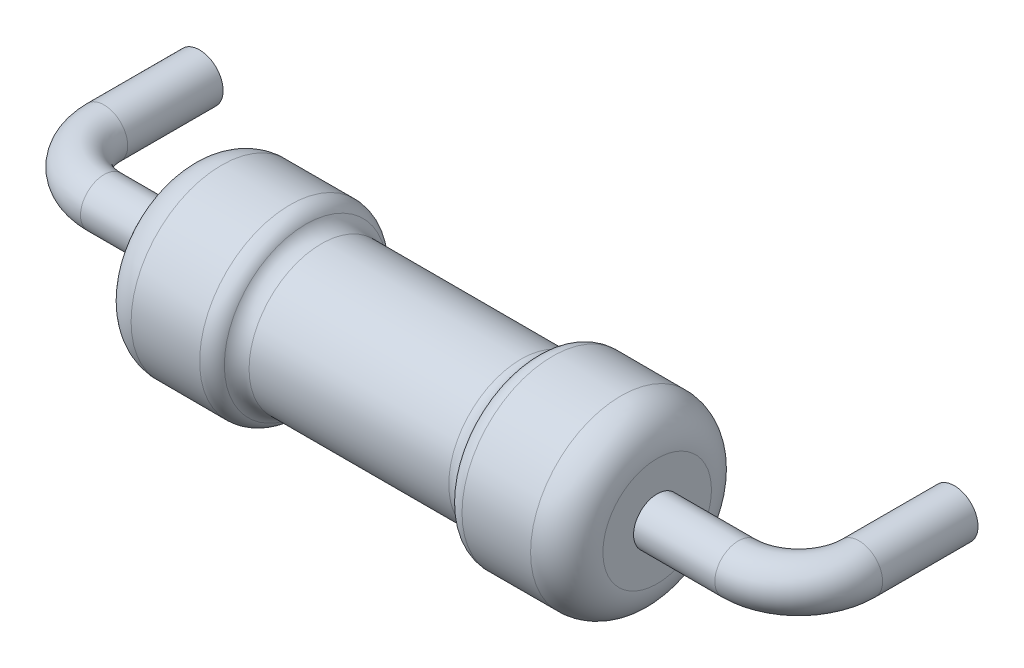
ISO-10303-21;
HEADER;
FILE_DESCRIPTION(('STEP AP214'),'2;1');
FILE_NAME('part.step','',(''),(''),'','','');
FILE_SCHEMA(('AUTOMOTIVE_DESIGN { 1 0 10303 214 1 1 1 1 }'));
ENDSEC;
DATA;
#1=APPLICATION_CONTEXT('core data for automotive mechanical design processes');
#2=APPLICATION_PROTOCOL_DEFINITION('international standard','automotive_design',2000,#1);
#3=PRODUCT_CONTEXT('',#1,'mechanical');
#4=PRODUCT('Part','Part','',(#3));
#5=PRODUCT_RELATED_PRODUCT_CATEGORY('part','',(#4));
#6=PRODUCT_DEFINITION_FORMATION('','',#4);
#7=PRODUCT_DEFINITION_CONTEXT('part definition',#1,'design');
#8=PRODUCT_DEFINITION('design','',#6,#7);
#9=PRODUCT_DEFINITION_SHAPE('','',#8);
#10=(LENGTH_UNIT() NAMED_UNIT(*) SI_UNIT(.MILLI.,.METRE.));
#11=(NAMED_UNIT(*) PLANE_ANGLE_UNIT() SI_UNIT($,.RADIAN.));
#12=(NAMED_UNIT(*) SI_UNIT($,.STERADIAN.) SOLID_ANGLE_UNIT());
#13=UNCERTAINTY_MEASURE_WITH_UNIT(LENGTH_MEASURE(1.E-05),#10,'distance_accuracy_value','');
#14=(GEOMETRIC_REPRESENTATION_CONTEXT(3) GLOBAL_UNCERTAINTY_ASSIGNED_CONTEXT((#13)) GLOBAL_UNIT_ASSIGNED_CONTEXT((#10,
#11,#12)) REPRESENTATION_CONTEXT('',''));
#15=CARTESIAN_POINT('',(0.,0.,0.));
#16=DIRECTION('',(0.,0.,1.));
#17=DIRECTION('',(1.,0.,0.));
#18=AXIS2_PLACEMENT_3D('',#15,#16,#17);
#19=CARTESIAN_POINT('',(3.,0.,1.38));
#20=DIRECTION('',(-1.,0.,0.));
#21=DIRECTION('',(0.,0.,-1.));
#22=AXIS2_PLACEMENT_3D('',#19,#20,#21);
#23=PLANE('',#22);
#24=CARTESIAN_POINT('',(3.,0.,1.38));
#25=DIRECTION('',(1.,0.,0.));
#26=DIRECTION('',(0.,0.,-1.));
#27=AXIS2_PLACEMENT_3D('',#24,#25,#26);
#28=CIRCLE('',#27,0.3);
#29=CARTESIAN_POINT('',(3.,0.,1.08));
#30=VERTEX_POINT('',#29);
#31=EDGE_CURVE('E58',#30,#30,#28,.T.);
#32=ORIENTED_EDGE('',*,*,#31,.F.);
#33=EDGE_LOOP('',(#32));
#34=FACE_BOUND('',#33,.T.);
#35=ADVANCED_FACE('F48',(#34),#23,.T.);
#36=CARTESIAN_POINT('',(3.,0.,1.38));
#37=DIRECTION('',(1.,0.,0.));
#38=DIRECTION('',(0.,0.,1.));
#39=AXIS2_PLACEMENT_3D('',#36,#37,#38);
#40=CYLINDRICAL_SURFACE('',#39,0.3);
#41=CARTESIAN_POINT('',(4.03333333333333,0.,1.38));
#42=DIRECTION('',(1.,0.,0.));
#43=DIRECTION('',(0.,0.,-1.));
#44=AXIS2_PLACEMENT_3D('',#41,#42,#43);
#45=CIRCLE('',#44,0.3);
#46=CARTESIAN_POINT('',(4.03333333333333,0.,1.68));
#47=VERTEX_POINT('',#46);
#48=EDGE_CURVE('E54',#47,#47,#45,.T.);
#49=ORIENTED_EDGE('',*,*,#48,.F.);
#50=EDGE_LOOP('',(#49));
#51=FACE_BOUND('',#50,.T.);
#52=ORIENTED_EDGE('',*,*,#31,.T.);
#53=EDGE_LOOP('',(#52));
#54=FACE_BOUND('',#53,.T.);
#55=ADVANCED_FACE('F59',(#51,#54),#40,.T.);
#56=CARTESIAN_POINT('',(4.03333333333333,0.,0.613333333333334));
#57=DIRECTION('',(0.,-1.,0.));
#58=DIRECTION('',(0.,0.,-1.));
#59=AXIS2_PLACEMENT_3D('',#56,#57,#58);
#60=TOROIDAL_SURFACE('',#59,0.766666666666666,0.3);
#61=CARTESIAN_POINT('',(4.8,0.,0.61333333333334));
#62=DIRECTION('',(0.,0.,-1.));
#63=DIRECTION('',(-1.,0.,0.));
#64=AXIS2_PLACEMENT_3D('',#61,#62,#63);
#65=CIRCLE('',#64,0.3);
#66=CARTESIAN_POINT('',(5.1,0.,0.613333333333343));
#67=VERTEX_POINT('',#66);
#68=EDGE_CURVE('E12',#67,#67,#65,.T.);
#69=CARTESIAN_POINT('',(4.03333333333333,0.,0.613333333333334));
#70=DIRECTION('',(0.,-1.,0.));
#71=DIRECTION('',(0.,0.,-1.));
#72=AXIS2_PLACEMENT_3D('',#69,#70,#71);
#73=CIRCLE('',#72,1.06666666666667);
#74=EDGE_CURVE('',#67,#47,#73,.T.);
#75=ORIENTED_EDGE('',*,*,#68,.F.);
#76=ORIENTED_EDGE('',*,*,#48,.T.);
#77=ORIENTED_EDGE('',*,*,#74,.T.);
#78=ORIENTED_EDGE('',*,*,#74,.F.);
#79=EDGE_LOOP('',(#75,#77,#76,#78));
#80=FACE_BOUND('',#79,.T.);
#81=ADVANCED_FACE('F72',(#80),#60,.T.);
#82=CARTESIAN_POINT('',(4.8,0.,0.613333333333334));
#83=DIRECTION('',(0.,0.,-1.));
#84=DIRECTION('',(1.,0.,0.));
#85=AXIS2_PLACEMENT_3D('',#82,#83,#84);
#86=CYLINDRICAL_SURFACE('',#85,0.3);
#87=ORIENTED_EDGE('',*,*,#68,.T.);
#88=EDGE_LOOP('',(#87));
#89=FACE_BOUND('',#88,.T.);
#90=CARTESIAN_POINT('',(4.8,0.,-0.6));
#91=DIRECTION('',(0.,0.,-1.));
#92=DIRECTION('',(-1.,0.,0.));
#93=AXIS2_PLACEMENT_3D('',#90,#91,#92);
#94=CIRCLE('',#93,0.3);
#95=CARTESIAN_POINT('',(4.5,0.,-0.6));
#96=VERTEX_POINT('',#95);
#97=EDGE_CURVE('E61',#96,#96,#94,.T.);
#98=ORIENTED_EDGE('',*,*,#97,.F.);
#99=EDGE_LOOP('',(#98));
#100=FACE_BOUND('',#99,.T.);
#101=ADVANCED_FACE('F70',(#89,#100),#86,.T.);
#102=CARTESIAN_POINT('',(4.8,0.,-0.6));
#103=DIRECTION('',(0.,0.,-1.));
#104=DIRECTION('',(-1.,0.,0.));
#105=AXIS2_PLACEMENT_3D('',#102,#103,#104);
#106=PLANE('',#105);
#107=ORIENTED_EDGE('',*,*,#97,.T.);
#108=EDGE_LOOP('',(#107));
#109=FACE_BOUND('',#108,.T.);
#110=ADVANCED_FACE('F68',(#109),#106,.T.);
#111=CLOSED_SHELL('',(#35,#55,#81,#101,#110));
#112=MANIFOLD_SOLID_BREP('B2',#111);
#113=CARTESIAN_POINT('',(-3.,0.,1.38));
#114=DIRECTION('',(1.,0.,0.));
#115=DIRECTION('',(0.,0.,-1.));
#116=AXIS2_PLACEMENT_3D('',#113,#114,#115);
#117=PLANE('',#116);
#118=CARTESIAN_POINT('',(-3.,0.,1.38));
#119=DIRECTION('',(1.,0.,0.));
#120=DIRECTION('',(0.,0.,-1.));
#121=AXIS2_PLACEMENT_3D('',#118,#119,#120);
#122=CIRCLE('',#121,0.3);
#123=CARTESIAN_POINT('',(-3.,0.,1.08));
#124=VERTEX_POINT('',#123);
#125=EDGE_CURVE('E159',#124,#124,#122,.T.);
#126=ORIENTED_EDGE('',*,*,#125,.T.);
#127=EDGE_LOOP('',(#126));
#128=FACE_BOUND('',#127,.T.);
#129=ADVANCED_FACE('F149',(#128),#117,.T.);
#130=CARTESIAN_POINT('',(-3.,0.,1.38));
#131=DIRECTION('',(-1.,0.,0.));
#132=DIRECTION('',(0.,0.,1.));
#133=AXIS2_PLACEMENT_3D('',#130,#131,#132);
#134=CYLINDRICAL_SURFACE('',#133,0.3);
#135=CARTESIAN_POINT('',(-4.03333333333333,0.,1.38));
#136=DIRECTION('',(1.,0.,0.));
#137=DIRECTION('',(0.,0.,-1.));
#138=AXIS2_PLACEMENT_3D('',#135,#136,#137);
#139=CIRCLE('',#138,0.3);
#140=CARTESIAN_POINT('',(-4.03333333333333,0.,1.68));
#141=VERTEX_POINT('',#140);
#142=EDGE_CURVE('E155',#141,#141,#139,.T.);
#143=ORIENTED_EDGE('',*,*,#142,.T.);
#144=EDGE_LOOP('',(#143));
#145=FACE_BOUND('',#144,.T.);
#146=ORIENTED_EDGE('',*,*,#125,.F.);
#147=EDGE_LOOP('',(#146));
#148=FACE_BOUND('',#147,.T.);
#149=ADVANCED_FACE('F160',(#145,#148),#134,.T.);
#150=CARTESIAN_POINT('',(-4.03333333333333,0.,0.613333333333334));
#151=DIRECTION('',(0.,-1.,0.));
#152=DIRECTION('',(0.,0.,-1.));
#153=AXIS2_PLACEMENT_3D('',#150,#151,#152);
#154=TOROIDAL_SURFACE('',#153,0.766666666666666,0.3);
#155=CARTESIAN_POINT('',(-4.8,0.,0.61333333333334));
#156=DIRECTION('',(0.,0.,1.));
#157=DIRECTION('',(1.,0.,0.));
#158=AXIS2_PLACEMENT_3D('',#155,#156,#157);
#159=CIRCLE('',#158,0.3);
#160=CARTESIAN_POINT('',(-5.1,0.,0.613333333333343));
#161=VERTEX_POINT('',#160);
#162=EDGE_CURVE('E46',#161,#161,#159,.T.);
#163=CARTESIAN_POINT('',(-4.03333333333333,0.,0.613333333333334));
#164=DIRECTION('',(0.,-1.,0.));
#165=DIRECTION('',(0.,0.,-1.));
#166=AXIS2_PLACEMENT_3D('',#163,#164,#165);
#167=CIRCLE('',#166,1.06666666666667);
#168=EDGE_CURVE('',#141,#161,#167,.T.);
#169=ORIENTED_EDGE('',*,*,#142,.F.);
#170=ORIENTED_EDGE('',*,*,#162,.T.);
#171=ORIENTED_EDGE('',*,*,#168,.T.);
#172=ORIENTED_EDGE('',*,*,#168,.F.);
#173=EDGE_LOOP('',(#169,#171,#170,#172));
#174=FACE_BOUND('',#173,.T.);
#175=ADVANCED_FACE('F173',(#174),#154,.T.);
#176=CARTESIAN_POINT('',(-4.8,0.,0.613333333333334));
#177=DIRECTION('',(0.,0.,-1.));
#178=DIRECTION('',(-1.,0.,0.));
#179=AXIS2_PLACEMENT_3D('',#176,#177,#178);
#180=CYLINDRICAL_SURFACE('',#179,0.3);
#181=ORIENTED_EDGE('',*,*,#162,.F.);
#182=EDGE_LOOP('',(#181));
#183=FACE_BOUND('',#182,.T.);
#184=CARTESIAN_POINT('',(-4.8,0.,-0.6));
#185=DIRECTION('',(0.,0.,-1.));
#186=DIRECTION('',(-1.,0.,0.));
#187=AXIS2_PLACEMENT_3D('',#184,#185,#186);
#188=CIRCLE('',#187,0.3);
#189=CARTESIAN_POINT('',(-5.1,0.,-0.6));
#190=VERTEX_POINT('',#189);
#191=EDGE_CURVE('E162',#190,#190,#188,.T.);
#192=ORIENTED_EDGE('',*,*,#191,.F.);
#193=EDGE_LOOP('',(#192));
#194=FACE_BOUND('',#193,.T.);
#195=ADVANCED_FACE('F171',(#183,#194),#180,.T.);
#196=CARTESIAN_POINT('',(-4.8,0.,-0.6));
#197=DIRECTION('',(0.,0.,-1.));
#198=DIRECTION('',(-1.,0.,0.));
#199=AXIS2_PLACEMENT_3D('',#196,#197,#198);
#200=PLANE('',#199);
#201=ORIENTED_EDGE('',*,*,#191,.T.);
#202=EDGE_LOOP('',(#201));
#203=FACE_BOUND('',#202,.T.);
#204=ADVANCED_FACE('F169',(#203),#200,.T.);
#205=CLOSED_SHELL('',(#129,#149,#175,#195,#204));
#206=MANIFOLD_SOLID_BREP('B6',#205);
#207=CARTESIAN_POINT('',(1.5,0.,1.38));
#208=DIRECTION('',(-1.,0.,0.));
#209=DIRECTION('',(0.,0.,1.));
#210=AXIS2_PLACEMENT_3D('',#207,#208,#209);
#211=CYLINDRICAL_SURFACE('',#210,0.92);
#212=CARTESIAN_POINT('',(-1.27,0.,1.38));
#213=DIRECTION('',(-1.,0.,0.));
#214=DIRECTION('',(0.,0.,1.));
#215=AXIS2_PLACEMENT_3D('',#212,#213,#214);
#216=CIRCLE('',#215,0.92);
#217=CARTESIAN_POINT('',(-1.27,0.,2.3));
#218=VERTEX_POINT('',#217);
#219=EDGE_CURVE('E243',#218,#218,#216,.F.);
#220=ORIENTED_EDGE('',*,*,#219,.T.);
#221=EDGE_LOOP('',(#220));
#222=FACE_BOUND('',#221,.T.);
#223=CARTESIAN_POINT('',(1.27,0.,1.38));
#224=DIRECTION('',(1.,0.,0.));
#225=DIRECTION('',(0.,0.,-1.));
#226=AXIS2_PLACEMENT_3D('',#223,#224,#225);
#227=CIRCLE('',#226,0.92);
#228=CARTESIAN_POINT('',(1.27,0.,0.46));
#229=VERTEX_POINT('',#228);
#230=EDGE_CURVE('E246',#229,#229,#227,.F.);
#231=ORIENTED_EDGE('',*,*,#230,.T.);
#232=EDGE_LOOP('',(#231));
#233=FACE_BOUND('',#232,.T.);
#234=ADVANCED_FACE('F223',(#222,#233),#211,.T.);
#235=CARTESIAN_POINT('',(-3.,0.,1.38));
#236=DIRECTION('',(1.,0.,0.));
#237=DIRECTION('',(0.,0.,-1.));
#238=AXIS2_PLACEMENT_3D('',#235,#236,#237);
#239=CYLINDRICAL_SURFACE('',#238,1.15);
#240=CARTESIAN_POINT('',(-1.66837168574094,0.,1.38));
#241=DIRECTION('',(1.,0.,0.));
#242=DIRECTION('',(0.,0.,-1.));
#243=AXIS2_PLACEMENT_3D('',#240,#241,#242);
#244=CIRCLE('',#243,1.15);
#245=CARTESIAN_POINT('',(-1.66837168574094,0.,0.23));
#246=VERTEX_POINT('',#245);
#247=EDGE_CURVE('E230',#246,#246,#244,.F.);
#248=ORIENTED_EDGE('',*,*,#247,.T.);
#249=EDGE_LOOP('',(#248));
#250=FACE_BOUND('',#249,.T.);
#251=CARTESIAN_POINT('',(-2.54,0.,1.38));
#252=DIRECTION('',(-1.,0.,0.));
#253=DIRECTION('',(0.,0.,1.));
#254=AXIS2_PLACEMENT_3D('',#251,#252,#253);
#255=CIRCLE('',#254,1.15);
#256=CARTESIAN_POINT('',(-2.54,0.,2.53));
#257=VERTEX_POINT('',#256);
#258=EDGE_CURVE('E249',#257,#257,#255,.F.);
#259=ORIENTED_EDGE('',*,*,#258,.T.);
#260=EDGE_LOOP('',(#259));
#261=FACE_BOUND('',#260,.T.);
#262=ADVANCED_FACE('F281',(#250,#261),#239,.T.);
#263=CARTESIAN_POINT('',(-3.,0.,1.38));
#264=DIRECTION('',(-1.,0.,0.));
#265=DIRECTION('',(0.,0.,1.));
#266=AXIS2_PLACEMENT_3D('',#263,#264,#265);
#267=PLANE('',#266);
#268=CARTESIAN_POINT('',(-3.,0.,1.38));
#269=DIRECTION('',(-1.,0.,0.));
#270=DIRECTION('',(0.,0.,1.));
#271=AXIS2_PLACEMENT_3D('',#268,#269,#270);
#272=CIRCLE('',#271,0.69);
#273=CARTESIAN_POINT('',(-3.,0.,2.07));
#274=VERTEX_POINT('',#273);
#275=EDGE_CURVE('E252',#274,#274,#272,.T.);
#276=ORIENTED_EDGE('',*,*,#275,.T.);
#277=EDGE_LOOP('',(#276));
#278=FACE_BOUND('',#277,.T.);
#279=ADVANCED_FACE('F286',(#278),#267,.T.);
#280=CARTESIAN_POINT('',(3.,0.,1.38));
#281=DIRECTION('',(-1.,0.,0.));
#282=DIRECTION('',(0.,0.,1.));
#283=AXIS2_PLACEMENT_3D('',#280,#281,#282);
#284=CYLINDRICAL_SURFACE('',#283,1.15);
#285=CARTESIAN_POINT('',(1.66837168574094,0.,1.38));
#286=DIRECTION('',(-1.,0.,0.));
#287=DIRECTION('',(0.,0.,1.));
#288=AXIS2_PLACEMENT_3D('',#285,#286,#287);
#289=CIRCLE('',#288,1.15);
#290=CARTESIAN_POINT('',(1.66837168574094,0.,2.53));
#291=VERTEX_POINT('',#290);
#292=EDGE_CURVE('E238',#291,#291,#289,.F.);
#293=ORIENTED_EDGE('',*,*,#292,.T.);
#294=EDGE_LOOP('',(#293));
#295=FACE_BOUND('',#294,.T.);
#296=CARTESIAN_POINT('',(2.54,0.,1.38));
#297=DIRECTION('',(1.,0.,0.));
#298=DIRECTION('',(0.,0.,-1.));
#299=AXIS2_PLACEMENT_3D('',#296,#297,#298);
#300=CIRCLE('',#299,1.15);
#301=CARTESIAN_POINT('',(2.54,0.,0.23));
#302=VERTEX_POINT('',#301);
#303=EDGE_CURVE('E255',#302,#302,#300,.F.);
#304=ORIENTED_EDGE('',*,*,#303,.T.);
#305=EDGE_LOOP('',(#304));
#306=FACE_BOUND('',#305,.T.);
#307=ADVANCED_FACE('F276',(#295,#306),#284,.T.);
#308=CARTESIAN_POINT('',(3.,0.,1.38));
#309=DIRECTION('',(1.,0.,0.));
#310=DIRECTION('',(0.,0.,-1.));
#311=AXIS2_PLACEMENT_3D('',#308,#309,#310);
#312=PLANE('',#311);
#313=CARTESIAN_POINT('',(3.,0.,1.38));
#314=DIRECTION('',(1.,0.,0.));
#315=DIRECTION('',(0.,0.,-1.));
#316=AXIS2_PLACEMENT_3D('',#313,#314,#315);
#317=CIRCLE('',#316,0.69);
#318=CARTESIAN_POINT('',(3.,0.,0.69));
#319=VERTEX_POINT('',#318);
#320=EDGE_CURVE('E258',#319,#319,#317,.T.);
#321=ORIENTED_EDGE('',*,*,#320,.T.);
#322=EDGE_LOOP('',(#321));
#323=FACE_BOUND('',#322,.T.);
#324=ADVANCED_FACE('F262',(#323),#312,.T.);
#325=CARTESIAN_POINT('',(2.54,0.,1.38));
#326=DIRECTION('',(1.,0.,0.));
#327=DIRECTION('',(0.,0.,-1.));
#328=AXIS2_PLACEMENT_3D('',#325,#326,#327);
#329=TOROIDAL_SURFACE('',#328,0.69,0.46);
#330=ORIENTED_EDGE('',*,*,#303,.F.);
#331=EDGE_LOOP('',(#330));
#332=FACE_BOUND('',#331,.T.);
#333=ORIENTED_EDGE('',*,*,#320,.F.);
#334=EDGE_LOOP('',(#333));
#335=FACE_BOUND('',#334,.T.);
#336=ADVANCED_FACE('F264',(#332,#335),#329,.T.);
#337=CARTESIAN_POINT('',(-2.54,0.,1.38));
#338=DIRECTION('',(-1.,0.,0.));
#339=DIRECTION('',(0.,0.,1.));
#340=AXIS2_PLACEMENT_3D('',#337,#338,#339);
#341=TOROIDAL_SURFACE('',#340,0.69,0.46);
#342=ORIENTED_EDGE('',*,*,#258,.F.);
#343=EDGE_LOOP('',(#342));
#344=FACE_BOUND('',#343,.T.);
#345=ORIENTED_EDGE('',*,*,#275,.F.);
#346=EDGE_LOOP('',(#345));
#347=FACE_BOUND('',#346,.T.);
#348=ADVANCED_FACE('F266',(#344,#347),#341,.T.);
#349=CARTESIAN_POINT('',(-1.27,0.,1.38));
#350=DIRECTION('',(-1.,0.,0.));
#351=DIRECTION('',(0.,0.,1.));
#352=AXIS2_PLACEMENT_3D('',#349,#350,#351);
#353=TOROIDAL_SURFACE('',#352,1.15,0.23);
#354=CARTESIAN_POINT('',(-1.46918584287044,0.,1.38));
#355=DIRECTION('',(1.,0.,0.));
#356=DIRECTION('',(0.,0.,-1.));
#357=AXIS2_PLACEMENT_3D('',#354,#355,#356);
#358=CIRCLE('',#357,1.03500000000004);
#359=CARTESIAN_POINT('',(-1.46918584287044,0.,0.344999999999964));
#360=VERTEX_POINT('',#359);
#361=EDGE_CURVE('E148',#360,#360,#358,.T.);
#362=ORIENTED_EDGE('',*,*,#361,.T.);
#363=EDGE_LOOP('',(#362));
#364=FACE_BOUND('',#363,.T.);
#365=ORIENTED_EDGE('',*,*,#219,.F.);
#366=EDGE_LOOP('',(#365));
#367=FACE_BOUND('',#366,.T.);
#368=ADVANCED_FACE('F273',(#364,#367),#353,.F.);
#369=CARTESIAN_POINT('',(1.27,0.,1.38));
#370=DIRECTION('',(1.,0.,0.));
#371=DIRECTION('',(0.,0.,-1.));
#372=AXIS2_PLACEMENT_3D('',#369,#370,#371);
#373=TOROIDAL_SURFACE('',#372,1.15,0.23);
#374=CARTESIAN_POINT('',(1.46918584287044,0.,1.38));
#375=DIRECTION('',(-1.,0.,0.));
#376=DIRECTION('',(0.,0.,1.));
#377=AXIS2_PLACEMENT_3D('',#374,#375,#376);
#378=CIRCLE('',#377,1.03500000000003);
#379=CARTESIAN_POINT('',(1.46918584287044,0.,2.41500000000003));
#380=VERTEX_POINT('',#379);
#381=EDGE_CURVE('E234',#380,#380,#378,.T.);
#382=ORIENTED_EDGE('',*,*,#381,.T.);
#383=EDGE_LOOP('',(#382));
#384=FACE_BOUND('',#383,.T.);
#385=ORIENTED_EDGE('',*,*,#230,.F.);
#386=EDGE_LOOP('',(#385));
#387=FACE_BOUND('',#386,.T.);
#388=ADVANCED_FACE('F302',(#384,#387),#373,.F.);
#389=CARTESIAN_POINT('',(1.66837168574094,0.,1.38));
#390=DIRECTION('',(-1.,0.,0.));
#391=DIRECTION('',(0.,0.,1.));
#392=AXIS2_PLACEMENT_3D('',#389,#390,#391);
#393=TOROIDAL_SURFACE('',#392,0.920000000000036,0.23);
#394=ORIENTED_EDGE('',*,*,#381,.F.);
#395=EDGE_LOOP('',(#394));
#396=FACE_BOUND('',#395,.T.);
#397=ORIENTED_EDGE('',*,*,#292,.F.);
#398=EDGE_LOOP('',(#397));
#399=FACE_BOUND('',#398,.T.);
#400=ADVANCED_FACE('F300',(#396,#399),#393,.T.);
#401=CARTESIAN_POINT('',(-1.66837168574094,0.,1.38));
#402=DIRECTION('',(1.,0.,0.));
#403=DIRECTION('',(0.,0.,-1.));
#404=AXIS2_PLACEMENT_3D('',#401,#402,#403);
#405=TOROIDAL_SURFACE('',#404,0.920000000000036,0.23);
#406=ORIENTED_EDGE('',*,*,#361,.F.);
#407=EDGE_LOOP('',(#406));
#408=FACE_BOUND('',#407,.T.);
#409=ORIENTED_EDGE('',*,*,#247,.F.);
#410=EDGE_LOOP('',(#409));
#411=FACE_BOUND('',#410,.T.);
#412=ADVANCED_FACE('F225',(#408,#411),#405,.T.);
#413=CLOSED_SHELL('',(#234,#262,#279,#307,#324,#336,#348,#368,#388,#400,#412));
#414=MANIFOLD_SOLID_BREP('B40',#413);
#415=ADVANCED_BREP_SHAPE_REPRESENTATION('',(#18,#112,#206,#414),#14);
#416=SHAPE_DEFINITION_REPRESENTATION(#9,#415);
ENDSEC;
END-ISO-10303-21;
